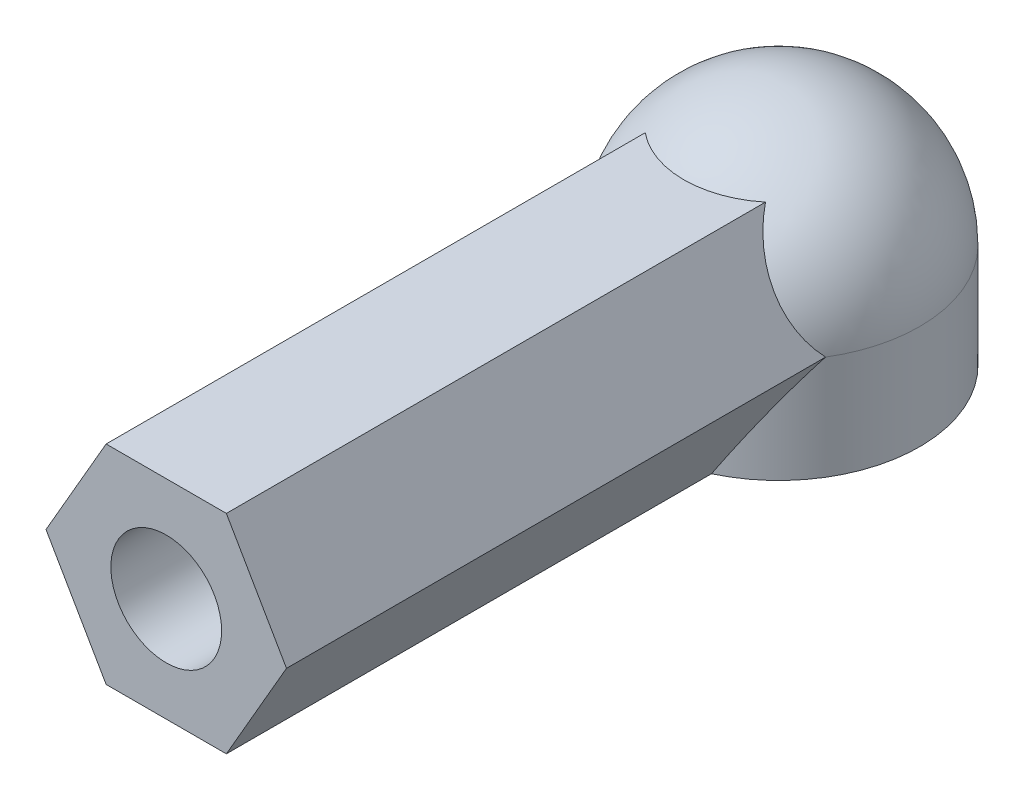
ISO-10303-21;
HEADER;
FILE_DESCRIPTION(('STEP AP214'),'2;1');
FILE_NAME('part.step','',(''),(''),'','','');
FILE_SCHEMA(('AUTOMOTIVE_DESIGN { 1 0 10303 214 1 1 1 1 }'));
ENDSEC;
DATA;
#1=APPLICATION_CONTEXT('core data for automotive mechanical design processes');
#2=APPLICATION_PROTOCOL_DEFINITION('international standard','automotive_design',2000,#1);
#3=PRODUCT_CONTEXT('',#1,'mechanical');
#4=PRODUCT('Part','Part','',(#3));
#5=PRODUCT_RELATED_PRODUCT_CATEGORY('part','',(#4));
#6=PRODUCT_DEFINITION_FORMATION('','',#4);
#7=PRODUCT_DEFINITION_CONTEXT('part definition',#1,'design');
#8=PRODUCT_DEFINITION('design','',#6,#7);
#9=PRODUCT_DEFINITION_SHAPE('','',#8);
#10=(LENGTH_UNIT() NAMED_UNIT(*) SI_UNIT(.MILLI.,.METRE.));
#11=(NAMED_UNIT(*) PLANE_ANGLE_UNIT() SI_UNIT($,.RADIAN.));
#12=(NAMED_UNIT(*) SI_UNIT($,.STERADIAN.) SOLID_ANGLE_UNIT());
#13=UNCERTAINTY_MEASURE_WITH_UNIT(LENGTH_MEASURE(1.E-05),#10,'distance_accuracy_value','');
#14=(GEOMETRIC_REPRESENTATION_CONTEXT(3) GLOBAL_UNCERTAINTY_ASSIGNED_CONTEXT((#13)) GLOBAL_UNIT_ASSIGNED_CONTEXT((#10,
#11,#12)) REPRESENTATION_CONTEXT('',''));
#15=CARTESIAN_POINT('',(0.,0.,0.));
#16=DIRECTION('',(0.,0.,1.));
#17=DIRECTION('',(1.,0.,0.));
#18=AXIS2_PLACEMENT_3D('',#15,#16,#17);
#19=CARTESIAN_POINT('',(0.,2.125,0.));
#20=DIRECTION('',(0.,-1.,0.));
#21=DIRECTION('',(1.,0.,0.));
#22=AXIS2_PLACEMENT_3D('',#19,#20,#21);
#23=SPHERICAL_SURFACE('',#22,2.875);
#24=CARTESIAN_POINT('',(0.,4.25,0.));
#25=DIRECTION('',(0.,-1.,0.));
#26=DIRECTION('',(0.,0.,-1.));
#27=AXIS2_PLACEMENT_3D('',#24,#25,#26);
#28=CIRCLE('',#27,1.93649167310371);
#29=CARTESIAN_POINT('',(-1.22686932202796,4.25,1.49826288303043));
#30=VERTEX_POINT('',#29);
#31=CARTESIAN_POINT('',(1.22686932202796,4.25,1.49826288303043));
#32=VERTEX_POINT('',#31);
#33=EDGE_CURVE('E99',#30,#32,#28,.F.);
#34=ORIENTED_EDGE('',*,*,#33,.T.);
#35=CARTESIAN_POINT('',(1.84030398304193,3.1875,0.));
#36=DIRECTION('',(-0.866025403784439,-0.5,0.));
#37=DIRECTION('',(0.5,-0.866025403784439,0.));
#38=AXIS2_PLACEMENT_3D('',#35,#36,#37);
#39=CIRCLE('',#38,1.93649167310371);
#40=CARTESIAN_POINT('',(2.45373864405591,2.125,1.49826288303044));
#41=VERTEX_POINT('',#40);
#42=EDGE_CURVE('E186',#32,#41,#39,.F.);
#43=ORIENTED_EDGE('',*,*,#42,.T.);
#44=CARTESIAN_POINT('',(0.,2.125,0.));
#45=DIRECTION('',(0.,-1.,0.));
#46=DIRECTION('',(0.,0.,-1.));
#47=AXIS2_PLACEMENT_3D('',#44,#45,#46);
#48=CIRCLE('',#47,2.875);
#49=CARTESIAN_POINT('',(-2.45373864405591,2.125,1.49826288303044));
#50=VERTEX_POINT('',#49);
#51=EDGE_CURVE('E194',#50,#41,#48,.T.);
#52=ORIENTED_EDGE('',*,*,#51,.F.);
#53=CARTESIAN_POINT('',(-1.84030398304193,3.1875,0.));
#54=DIRECTION('',(0.866025403784439,-0.5,0.));
#55=DIRECTION('',(0.5,0.866025403784439,0.));
#56=AXIS2_PLACEMENT_3D('',#53,#54,#55);
#57=CIRCLE('',#56,1.93649167310371);
#58=EDGE_CURVE('E183',#50,#30,#57,.F.);
#59=ORIENTED_EDGE('',*,*,#58,.T.);
#60=EDGE_LOOP('',(#34,#43,#52,#59));
#61=FACE_BOUND('',#60,.T.);
#62=ADVANCED_FACE('F36',(#61),#23,.T.);
#63=CARTESIAN_POINT('',(0.,0.,0.));
#64=DIRECTION('',(0.,-1.,0.));
#65=DIRECTION('',(0.,0.,-1.));
#66=AXIS2_PLACEMENT_3D('',#63,#64,#65);
#67=CYLINDRICAL_SURFACE('',#66,2.875);
#68=CARTESIAN_POINT('',(0.,0.,0.));
#69=DIRECTION('',(0.,-1.,0.));
#70=DIRECTION('',(0.,0.,-1.));
#71=AXIS2_PLACEMENT_3D('',#68,#69,#70);
#72=CIRCLE('',#71,2.875);
#73=CARTESIAN_POINT('',(-1.22686932202796,0.,2.60008012697045));
#74=VERTEX_POINT('',#73);
#75=CARTESIAN_POINT('',(1.22686932202795,0.,2.60008012697045));
#76=VERTEX_POINT('',#75);
#77=EDGE_CURVE('E197',#74,#76,#72,.T.);
#78=ORIENTED_EDGE('',*,*,#77,.F.);
#79=CARTESIAN_POINT('',(0.,-2.125,0.));
#80=DIRECTION('',(0.866025403784439,0.5,0.));
#81=DIRECTION('',(0.5,-0.866025403784439,0.));
#82=AXIS2_PLACEMENT_3D('',#79,#80,#81);
#83=ELLIPSE('',#82,5.75,2.875);
#84=EDGE_CURVE('E179',#74,#50,#83,.F.);
#85=ORIENTED_EDGE('',*,*,#84,.T.);
#86=ORIENTED_EDGE('',*,*,#51,.T.);
#87=CARTESIAN_POINT('',(0.,-2.125,0.));
#88=DIRECTION('',(-0.866025403784439,0.5,0.));
#89=DIRECTION('',(-0.5,-0.866025403784439,0.));
#90=AXIS2_PLACEMENT_3D('',#87,#88,#89);
#91=ELLIPSE('',#90,5.75,2.875);
#92=EDGE_CURVE('E199',#41,#76,#91,.F.);
#93=ORIENTED_EDGE('',*,*,#92,.T.);
#94=EDGE_LOOP('',(#78,#85,#86,#93));
#95=FACE_BOUND('',#94,.T.);
#96=ADVANCED_FACE('F128',(#95),#67,.T.);
#97=CARTESIAN_POINT('',(2.875,0.,0.));
#98=DIRECTION('',(0.,-1.,0.));
#99=DIRECTION('',(0.,0.,-1.));
#100=AXIS2_PLACEMENT_3D('',#97,#98,#99);
#101=PLANE('',#100);
#102=CARTESIAN_POINT('',(0.,0.,0.));
#103=DIRECTION('',(0.,-1.,0.));
#104=DIRECTION('',(0.,0.,-1.));
#105=AXIS2_PLACEMENT_3D('',#102,#103,#104);
#106=CIRCLE('',#105,2.475);
#107=CARTESIAN_POINT('',(0.,0.,-2.475));
#108=VERTEX_POINT('',#107);
#109=EDGE_CURVE('E11',#108,#108,#106,.F.);
#110=ORIENTED_EDGE('',*,*,#109,.T.);
#111=EDGE_LOOP('',(#110));
#112=FACE_BOUND('',#111,.T.);
#113=DIRECTION('',(0.,0.,-1.));
#114=VECTOR('',#113,1.);
#115=CARTESIAN_POINT('',(-1.22686932202796,0.,12.5));
#116=LINE('',#115,#114);
#117=CARTESIAN_POINT('',(-1.22686932202796,0.,12.5));
#118=VERTEX_POINT('',#117);
#119=EDGE_CURVE('E177',#118,#74,#116,.T.);
#120=ORIENTED_EDGE('',*,*,#119,.T.);
#121=ORIENTED_EDGE('',*,*,#77,.T.);
#122=DIRECTION('',(0.,0.,-1.));
#123=VECTOR('',#122,1.);
#124=CARTESIAN_POINT('',(1.22686932202795,0.,12.5));
#125=LINE('',#124,#123);
#126=CARTESIAN_POINT('',(1.22686932202795,0.,12.5));
#127=VERTEX_POINT('',#126);
#128=EDGE_CURVE('E58',#127,#76,#125,.T.);
#129=ORIENTED_EDGE('',*,*,#128,.F.);
#130=DIRECTION('',(1.,0.,0.));
#131=VECTOR('',#130,1.);
#132=CARTESIAN_POINT('',(-1.22686932202796,0.,12.5));
#133=LINE('',#132,#131);
#134=EDGE_CURVE('E170',#118,#127,#133,.T.);
#135=ORIENTED_EDGE('',*,*,#134,.F.);
#136=EDGE_LOOP('',(#120,#121,#129,#135));
#137=FACE_BOUND('',#136,.T.);
#138=ADVANCED_FACE('F133',(#112,#137),#101,.T.);
#139=CARTESIAN_POINT('',(-2.45373864405591,2.125,12.5));
#140=DIRECTION('',(0.866025403784439,0.5,0.));
#141=DIRECTION('',(-0.5,0.866025403784439,0.));
#142=AXIS2_PLACEMENT_3D('',#139,#140,#141);
#143=PLANE('',#142);
#144=ORIENTED_EDGE('',*,*,#84,.F.);
#145=ORIENTED_EDGE('',*,*,#119,.F.);
#146=DIRECTION('',(0.5,-0.866025403784439,0.));
#147=VECTOR('',#146,1.);
#148=CARTESIAN_POINT('',(-2.45373864405591,2.125,12.5));
#149=LINE('',#148,#147);
#150=CARTESIAN_POINT('',(-2.45373864405591,2.125,12.5));
#151=VERTEX_POINT('',#150);
#152=EDGE_CURVE('E168',#151,#118,#149,.T.);
#153=ORIENTED_EDGE('',*,*,#152,.F.);
#154=DIRECTION('',(0.,0.,-1.));
#155=VECTOR('',#154,1.);
#156=CARTESIAN_POINT('',(-2.45373864405591,2.125,12.5));
#157=LINE('',#156,#155);
#158=EDGE_CURVE('E208',#151,#50,#157,.T.);
#159=ORIENTED_EDGE('',*,*,#158,.T.);
#160=EDGE_LOOP('',(#144,#145,#153,#159));
#161=FACE_BOUND('',#160,.T.);
#162=ADVANCED_FACE('F139',(#161),#143,.F.);
#163=CARTESIAN_POINT('',(1.22686932202795,0.,12.5));
#164=DIRECTION('',(-0.866025403784439,0.5,0.));
#165=DIRECTION('',(-0.5,-0.866025403784439,0.));
#166=AXIS2_PLACEMENT_3D('',#163,#164,#165);
#167=PLANE('',#166);
#168=ORIENTED_EDGE('',*,*,#92,.F.);
#169=DIRECTION('',(0.,0.,-1.));
#170=VECTOR('',#169,1.);
#171=CARTESIAN_POINT('',(2.45373864405591,2.125,12.5));
#172=LINE('',#171,#170);
#173=CARTESIAN_POINT('',(2.45373864405591,2.125,12.5));
#174=VERTEX_POINT('',#173);
#175=EDGE_CURVE('E188',#174,#41,#172,.T.);
#176=ORIENTED_EDGE('',*,*,#175,.F.);
#177=DIRECTION('',(0.5,0.866025403784439,0.));
#178=VECTOR('',#177,1.);
#179=CARTESIAN_POINT('',(1.22686932202795,0.,12.5));
#180=LINE('',#179,#178);
#181=EDGE_CURVE('E217',#127,#174,#180,.T.);
#182=ORIENTED_EDGE('',*,*,#181,.F.);
#183=ORIENTED_EDGE('',*,*,#128,.T.);
#184=EDGE_LOOP('',(#168,#176,#182,#183));
#185=FACE_BOUND('',#184,.T.);
#186=ADVANCED_FACE('F144',(#185),#167,.F.);
#187=CARTESIAN_POINT('',(2.45373864405591,2.125,12.5));
#188=DIRECTION('',(-0.866025403784439,-0.5,0.));
#189=DIRECTION('',(0.5,-0.866025403784439,0.));
#190=AXIS2_PLACEMENT_3D('',#187,#188,#189);
#191=PLANE('',#190);
#192=ORIENTED_EDGE('',*,*,#42,.F.);
#193=DIRECTION('',(0.,0.,-1.));
#194=VECTOR('',#193,1.);
#195=CARTESIAN_POINT('',(1.22686932202796,4.25,12.5));
#196=LINE('',#195,#194);
#197=CARTESIAN_POINT('',(1.22686932202796,4.25,12.5));
#198=VERTEX_POINT('',#197);
#199=EDGE_CURVE('E207',#198,#32,#196,.T.);
#200=ORIENTED_EDGE('',*,*,#199,.F.);
#201=DIRECTION('',(-0.5,0.866025403784439,0.));
#202=VECTOR('',#201,1.);
#203=CARTESIAN_POINT('',(2.45373864405591,2.125,12.5));
#204=LINE('',#203,#202);
#205=EDGE_CURVE('E216',#174,#198,#204,.T.);
#206=ORIENTED_EDGE('',*,*,#205,.F.);
#207=ORIENTED_EDGE('',*,*,#175,.T.);
#208=EDGE_LOOP('',(#192,#200,#206,#207));
#209=FACE_BOUND('',#208,.T.);
#210=ADVANCED_FACE('F148',(#209),#191,.F.);
#211=CARTESIAN_POINT('',(1.22686932202796,4.25,12.5));
#212=DIRECTION('',(0.,-1.,0.));
#213=DIRECTION('',(0.,0.,-1.));
#214=AXIS2_PLACEMENT_3D('',#211,#212,#213);
#215=PLANE('',#214);
#216=ORIENTED_EDGE('',*,*,#33,.F.);
#217=DIRECTION('',(0.,0.,-1.));
#218=VECTOR('',#217,1.);
#219=CARTESIAN_POINT('',(-1.22686932202796,4.25,12.5));
#220=LINE('',#219,#218);
#221=CARTESIAN_POINT('',(-1.22686932202796,4.25,12.5));
#222=VERTEX_POINT('',#221);
#223=EDGE_CURVE('E205',#222,#30,#220,.T.);
#224=ORIENTED_EDGE('',*,*,#223,.F.);
#225=DIRECTION('',(-1.,0.,0.));
#226=VECTOR('',#225,1.);
#227=CARTESIAN_POINT('',(1.22686932202796,4.25,12.5));
#228=LINE('',#227,#226);
#229=EDGE_CURVE('E223',#198,#222,#228,.T.);
#230=ORIENTED_EDGE('',*,*,#229,.F.);
#231=ORIENTED_EDGE('',*,*,#199,.T.);
#232=EDGE_LOOP('',(#216,#224,#230,#231));
#233=FACE_BOUND('',#232,.T.);
#234=ADVANCED_FACE('F151',(#233),#215,.F.);
#235=CARTESIAN_POINT('',(-1.22686932202796,4.25,12.5));
#236=DIRECTION('',(0.866025403784439,-0.5,0.));
#237=DIRECTION('',(0.5,0.866025403784439,0.));
#238=AXIS2_PLACEMENT_3D('',#235,#236,#237);
#239=PLANE('',#238);
#240=ORIENTED_EDGE('',*,*,#58,.F.);
#241=ORIENTED_EDGE('',*,*,#158,.F.);
#242=DIRECTION('',(-0.5,-0.866025403784439,0.));
#243=VECTOR('',#242,1.);
#244=CARTESIAN_POINT('',(-1.22686932202796,4.25,12.5));
#245=LINE('',#244,#243);
#246=EDGE_CURVE('E172',#222,#151,#245,.T.);
#247=ORIENTED_EDGE('',*,*,#246,.F.);
#248=ORIENTED_EDGE('',*,*,#223,.T.);
#249=EDGE_LOOP('',(#240,#241,#247,#248));
#250=FACE_BOUND('',#249,.T.);
#251=ADVANCED_FACE('F155',(#250),#239,.F.);
#252=CARTESIAN_POINT('',(0.,0.,12.5));
#253=DIRECTION('',(0.,0.,1.));
#254=DIRECTION('',(1.,0.,0.));
#255=AXIS2_PLACEMENT_3D('',#252,#253,#254);
#256=PLANE('',#255);
#257=CARTESIAN_POINT('',(0.,2.125,12.5));
#258=DIRECTION('',(0.,0.,1.));
#259=DIRECTION('',(1.,0.,0.));
#260=AXIS2_PLACEMENT_3D('',#257,#258,#259);
#261=CIRCLE('',#260,1.13029999999999);
#262=CARTESIAN_POINT('',(1.13029999999999,2.125,12.5));
#263=VERTEX_POINT('',#262);
#264=EDGE_CURVE('E103',#263,#263,#261,.T.);
#265=ORIENTED_EDGE('',*,*,#264,.F.);
#266=EDGE_LOOP('',(#265));
#267=FACE_BOUND('',#266,.T.);
#268=ORIENTED_EDGE('',*,*,#152,.T.);
#269=ORIENTED_EDGE('',*,*,#134,.T.);
#270=ORIENTED_EDGE('',*,*,#181,.T.);
#271=ORIENTED_EDGE('',*,*,#205,.T.);
#272=ORIENTED_EDGE('',*,*,#229,.T.);
#273=ORIENTED_EDGE('',*,*,#246,.T.);
#274=EDGE_LOOP('',(#268,#269,#270,#271,#272,#273));
#275=FACE_BOUND('',#274,.T.);
#276=ADVANCED_FACE('F126',(#267,#275),#256,.T.);
#277=CARTESIAN_POINT('',(0.,2.125,12.5));
#278=DIRECTION('',(0.,0.,1.));
#279=DIRECTION('',(1.,0.,0.));
#280=AXIS2_PLACEMENT_3D('',#277,#278,#279);
#281=CYLINDRICAL_SURFACE('',#280,1.13029999999999);
#282=CARTESIAN_POINT('',(1.13029999999999,2.125,1.7698649411749));
#283=CARTESIAN_POINT('',(1.13030261115983,2.09575360179437,1.76985812964121));
#284=CARTESIAN_POINT('',(1.12916414924468,2.06652446809745,1.77059075442161));
#285=CARTESIAN_POINT('',(1.12464084653318,2.00833158419443,1.77346949448521));
#286=CARTESIAN_POINT('',(1.12125765234419,1.97936765522612,1.77561457366381));
#287=CARTESIAN_POINT('',(1.10785831603833,1.89357955707868,1.78403059401583));
#288=CARTESIAN_POINT('',(1.09459118721806,1.83742120693472,1.79228427701698));
#289=CARTESIAN_POINT('',(1.06007042770318,1.72865945919755,1.81291105269942));
#290=CARTESIAN_POINT('',(1.03883695547458,1.67604748078762,1.82527373880269));
#291=CARTESIAN_POINT('',(0.989095682139117,1.57505232956898,1.85269978138413));
#292=CARTESIAN_POINT('',(0.960574721398186,1.52667702174,1.86776800869661));
#293=CARTESIAN_POINT('',(0.893891155298775,1.43053630090667,1.90064908091922));
#294=CARTESIAN_POINT('',(0.855066951861251,1.38327253945198,1.91858658012701));
#295=CARTESIAN_POINT('',(0.770255340809199,1.29553689108083,1.95418083418798));
#296=CARTESIAN_POINT('',(0.724265766188451,1.25506706655603,1.9718375023239));
#297=CARTESIAN_POINT('',(0.62186264726303,1.17881757065646,2.00659880351079));
#298=CARTESIAN_POINT('',(0.564905483441897,1.14368719033224,2.02354170260087));
#299=CARTESIAN_POINT('',(0.444804128217229,1.08374046904866,2.05328138860545));
#300=CARTESIAN_POINT('',(0.381664381598685,1.05891678470423,2.06608112603007));
#301=CARTESIAN_POINT('',(0.256361373679126,1.02238190735998,2.08517785959711));
#302=CARTESIAN_POINT('',(0.194527170254836,1.00977750930031,2.09191465640165));
#303=CARTESIAN_POINT('',(0.0692852953457552,0.995068742471738,2.09979179768099));
#304=CARTESIAN_POINT('',(0.00587876530902643,0.992956968484371,2.10093608908326));
#305=CARTESIAN_POINT('',(-0.113872174030065,0.999015424386723,2.09767981481665));
#306=CARTESIAN_POINT('',(-0.170286502340079,1.00617468036278,2.09382438998262));
#307=CARTESIAN_POINT('',(-0.280968091384864,1.02872224037686,2.08186349249329));
#308=CARTESIAN_POINT('',(-0.335235225859458,1.04411102756111,2.07375777030848));
#309=CARTESIAN_POINT('',(-0.44091782565677,1.0827075660556,2.05390342075067));
#310=CARTESIAN_POINT('',(-0.492292667216572,1.10600438592403,2.04211342299745));
#311=CARTESIAN_POINT('',(-0.590511136785598,1.15959437336088,2.01590776047182));
#312=CARTESIAN_POINT('',(-0.637353226994597,1.18988990361546,2.0014912093526));
#313=CARTESIAN_POINT('',(-0.730421630835328,1.26023840465397,1.96955597834329));
#314=CARTESIAN_POINT('',(-0.776069514485627,1.30098103125879,1.95187053736841));
#315=CARTESIAN_POINT('',(-0.860229134140478,1.38926286551899,1.91627200671159));
#316=CARTESIAN_POINT('',(-0.898732619014043,1.43680982072702,1.89835867903091));
#317=CARTESIAN_POINT('',(-0.970653947747759,1.5420758208629,1.86267894741897));
#318=CARTESIAN_POINT('',(-1.0033899931856,1.60031048103228,1.84504663304176));
#319=CARTESIAN_POINT('',(-1.05832215495973,1.72251344023675,1.8140984831099));
#320=CARTESIAN_POINT('',(-1.08054738820092,1.78646530939859,1.80077075595346));
#321=CARTESIAN_POINT('',(-1.10789938846503,1.89651176889595,1.78402124704928));
#322=CARTESIAN_POINT('',(-1.11624739716343,1.94154412435852,1.77878231535884));
#323=CARTESIAN_POINT('',(-1.12747001405434,2.03269390500726,1.77167286293834));
#324=CARTESIAN_POINT('',(-1.13032622648832,2.0788144550085,1.76981366436224));
#325=CARTESIAN_POINT('',(-1.13029999999999,2.125,1.7698649411749));
#326=B_SPLINE_CURVE_WITH_KNOTS('',3,(#282,#283,#284,#285,#286,#287,#288,#289,#290,#291,#292,
#293,#294,#295,#296,#297,#298,#299,#300,#301,#302,#303,#304,#305,#306,#307,#308,#309,#310,#311,
#312,#313,#314,#315,#316,#317,#318,#319,#320,#321,#322,#323,#324,#325),.UNSPECIFIED.,.F.,.F.,(4,
2,2,2,2,2,2,2,2,2,2,2,2,2,2,2,2,2,2,2,2,4),(0.,0.0876752951954356,0.175286347801236,
0.349214169121005,0.522704810420636,0.696510980245252,0.886954623983637,1.07745597534071,
1.28345334396428,1.48930368926649,1.67861664136241,1.86779596596114,2.03798268918716,
2.20817940497555,2.38036042347557,2.55259965351884,2.74288011090171,2.93337897540349,
3.13959680550778,3.34523997828644,3.48309885838307,3.62141872254316),.UNSPECIFIED.);
#327=CARTESIAN_POINT('',(1.13029999999999,2.125,1.7698649411749));
#328=VERTEX_POINT('',#327);
#329=CARTESIAN_POINT('',(-1.13029999999999,2.125,1.7698649411749));
#330=VERTEX_POINT('',#329);
#331=EDGE_CURVE('E94',#328,#330,#326,.T.);
#332=ORIENTED_EDGE('',*,*,#331,.T.);
#333=CARTESIAN_POINT('',(0.,2.125,1.7698649411749));
#334=DIRECTION('',(0.,0.,-1.));
#335=DIRECTION('',(-1.,0.,0.));
#336=AXIS2_PLACEMENT_3D('',#333,#334,#335);
#337=CIRCLE('',#336,1.13029999999999);
#338=EDGE_CURVE('E98',#330,#328,#337,.T.);
#339=ORIENTED_EDGE('',*,*,#338,.T.);
#340=EDGE_LOOP('',(#332,#339));
#341=FACE_BOUND('',#340,.T.);
#342=ORIENTED_EDGE('',*,*,#264,.T.);
#343=EDGE_LOOP('',(#342));
#344=FACE_BOUND('',#343,.T.);
#345=ADVANCED_FACE('F105',(#341,#344),#281,.F.);
#346=CARTESIAN_POINT('',(0.,2.125,0.));
#347=DIRECTION('',(0.,-1.,0.));
#348=DIRECTION('',(0.,0.,-1.));
#349=AXIS2_PLACEMENT_3D('',#346,#347,#348);
#350=SPHERICAL_SURFACE('',#349,2.1);
#351=CARTESIAN_POINT('',(0.,2.125,0.));
#352=DIRECTION('',(0.,-1.,0.));
#353=DIRECTION('',(0.,0.,-1.));
#354=AXIS2_PLACEMENT_3D('',#351,#352,#353);
#355=CIRCLE('',#354,2.1);
#356=EDGE_CURVE('E50',#330,#328,#355,.T.);
#357=ORIENTED_EDGE('',*,*,#356,.T.);
#358=ORIENTED_EDGE('',*,*,#338,.F.);
#359=EDGE_LOOP('',(#357,#358));
#360=FACE_BOUND('',#359,.T.);
#361=ADVANCED_FACE('F102',(#360),#350,.F.);
#362=CARTESIAN_POINT('',(0.,0.,0.));
#363=DIRECTION('',(0.,-1.,0.));
#364=DIRECTION('',(0.,0.,-1.));
#365=AXIS2_PLACEMENT_3D('',#362,#363,#364);
#366=CYLINDRICAL_SURFACE('',#365,2.1);
#367=CARTESIAN_POINT('',(0.,0.375,0.));
#368=DIRECTION('',(0.,-1.,0.));
#369=DIRECTION('',(0.,0.,-1.));
#370=AXIS2_PLACEMENT_3D('',#367,#368,#369);
#371=CIRCLE('',#370,2.1);
#372=CARTESIAN_POINT('',(0.,0.375,-2.1));
#373=VERTEX_POINT('',#372);
#374=EDGE_CURVE('E44',#373,#373,#371,.T.);
#375=ORIENTED_EDGE('',*,*,#374,.T.);
#376=EDGE_LOOP('',(#375));
#377=FACE_BOUND('',#376,.T.);
#378=ORIENTED_EDGE('',*,*,#356,.F.);
#379=ORIENTED_EDGE('',*,*,#331,.F.);
#380=EDGE_LOOP('',(#378,#379));
#381=FACE_BOUND('',#380,.T.);
#382=ADVANCED_FACE('F95',(#377,#381),#366,.F.);
#383=CARTESIAN_POINT('',(0.,0.375,0.));
#384=DIRECTION('',(0.,-1.,0.));
#385=DIRECTION('',(0.,0.,-1.));
#386=AXIS2_PLACEMENT_3D('',#383,#384,#385);
#387=CONICAL_SURFACE('',#386,2.1,0.78539816339745);
#388=ORIENTED_EDGE('',*,*,#109,.F.);
#389=EDGE_LOOP('',(#388));
#390=FACE_BOUND('',#389,.T.);
#391=ORIENTED_EDGE('',*,*,#374,.F.);
#392=EDGE_LOOP('',(#391));
#393=FACE_BOUND('',#392,.T.);
#394=ADVANCED_FACE('F38',(#390,#393),#387,.F.);
#395=CLOSED_SHELL('',(#62,#96,#138,#162,#186,#210,#234,#251,#276,#345,#361,#382,#394));
#396=MANIFOLD_SOLID_BREP('B2',#395);
#397=ADVANCED_BREP_SHAPE_REPRESENTATION('',(#18,#396),#14);
#398=SHAPE_DEFINITION_REPRESENTATION(#9,#397);
ENDSEC;
END-ISO-10303-21;
